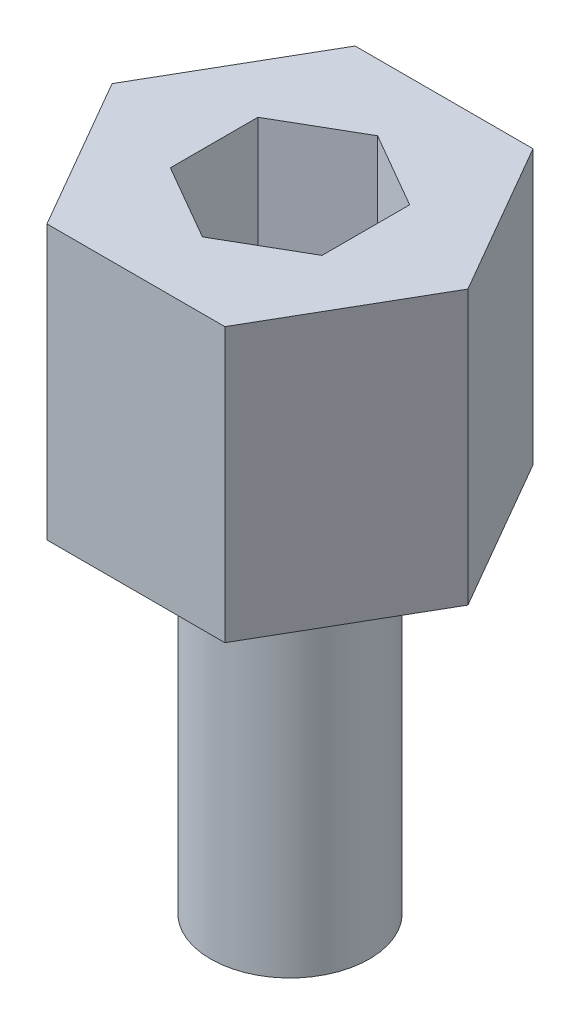
ISO-10303-21;
HEADER;
FILE_DESCRIPTION(('STEP AP214'),'2;1');
FILE_NAME('part.step','',(''),(''),'','','');
FILE_SCHEMA(('AUTOMOTIVE_DESIGN { 1 0 10303 214 1 1 1 1 }'));
ENDSEC;
DATA;
#1=APPLICATION_CONTEXT('core data for automotive mechanical design processes');
#2=APPLICATION_PROTOCOL_DEFINITION('international standard','automotive_design',2000,#1);
#3=PRODUCT_CONTEXT('',#1,'mechanical');
#4=PRODUCT('Part','Part','',(#3));
#5=PRODUCT_RELATED_PRODUCT_CATEGORY('part','',(#4));
#6=PRODUCT_DEFINITION_FORMATION('','',#4);
#7=PRODUCT_DEFINITION_CONTEXT('part definition',#1,'design');
#8=PRODUCT_DEFINITION('design','',#6,#7);
#9=PRODUCT_DEFINITION_SHAPE('','',#8);
#10=(LENGTH_UNIT() NAMED_UNIT(*) SI_UNIT(.MILLI.,.METRE.));
#11=(NAMED_UNIT(*) PLANE_ANGLE_UNIT() SI_UNIT($,.RADIAN.));
#12=(NAMED_UNIT(*) SI_UNIT($,.STERADIAN.) SOLID_ANGLE_UNIT());
#13=UNCERTAINTY_MEASURE_WITH_UNIT(LENGTH_MEASURE(1.E-05),#10,'distance_accuracy_value','');
#14=(GEOMETRIC_REPRESENTATION_CONTEXT(3) GLOBAL_UNCERTAINTY_ASSIGNED_CONTEXT((#13)) GLOBAL_UNIT_ASSIGNED_CONTEXT((#10,
#11,#12)) REPRESENTATION_CONTEXT('',''));
#15=CARTESIAN_POINT('',(0.,0.,0.));
#16=DIRECTION('',(0.,0.,1.));
#17=DIRECTION('',(1.,0.,0.));
#18=AXIS2_PLACEMENT_3D('',#15,#16,#17);
#19=CARTESIAN_POINT('',(0.,25.,0.));
#20=DIRECTION('',(0.,-1.,0.));
#21=DIRECTION('',(0.,0.,-1.));
#22=AXIS2_PLACEMENT_3D('',#19,#20,#21);
#23=CYLINDRICAL_SURFACE('',#22,1.6);
#24=CARTESIAN_POINT('',(0.,0.,0.));
#25=DIRECTION('',(0.,-1.,0.));
#26=DIRECTION('',(0.,0.,-1.));
#27=AXIS2_PLACEMENT_3D('',#24,#25,#26);
#28=CIRCLE('',#27,1.6);
#29=CARTESIAN_POINT('',(0.,0.,-1.6));
#30=VERTEX_POINT('',#29);
#31=EDGE_CURVE('E149',#30,#30,#28,.T.);
#32=CARTESIAN_POINT('',(0.,16.,0.));
#33=DIRECTION('',(0.,1.,0.));
#34=DIRECTION('',(0.,0.,1.));
#35=AXIS2_PLACEMENT_3D('',#32,#33,#34);
#36=CIRCLE('',#35,1.6);
#37=CARTESIAN_POINT('',(0.,16.,-1.6));
#38=VERTEX_POINT('',#37);
#39=EDGE_CURVE('E43',#38,#38,#36,.F.);
#40=CARTESIAN_POINT('',(0.,0.,-1.6));
#41=CARTESIAN_POINT('',(0.,0.166666666666667,-1.6));
#42=CARTESIAN_POINT('',(0.,0.333333333333334,-1.6));
#43=CARTESIAN_POINT('',(0.,0.666666666666667,-1.6));
#44=CARTESIAN_POINT('',(0.,0.833333333333334,-1.6));
#45=CARTESIAN_POINT('',(0.,1.16666666666667,-1.6));
#46=CARTESIAN_POINT('',(0.,1.33333333333333,-1.6));
#47=CARTESIAN_POINT('',(0.,1.66666666666667,-1.6));
#48=CARTESIAN_POINT('',(0.,1.83333333333334,-1.6));
#49=CARTESIAN_POINT('',(0.,2.16666666666667,-1.6));
#50=CARTESIAN_POINT('',(0.,2.33333333333333,-1.6));
#51=CARTESIAN_POINT('',(0.,2.66666666666667,-1.6));
#52=CARTESIAN_POINT('',(0.,2.83333333333333,-1.6));
#53=CARTESIAN_POINT('',(0.,3.16666666666667,-1.6));
#54=CARTESIAN_POINT('',(0.,3.33333333333333,-1.6));
#55=CARTESIAN_POINT('',(0.,3.66666666666667,-1.6));
#56=CARTESIAN_POINT('',(0.,3.83333333333333,-1.6));
#57=CARTESIAN_POINT('',(0.,4.16666666666667,-1.6));
#58=CARTESIAN_POINT('',(0.,4.33333333333333,-1.6));
#59=CARTESIAN_POINT('',(0.,4.66666666666667,-1.6));
#60=CARTESIAN_POINT('',(0.,4.83333333333333,-1.6));
#61=CARTESIAN_POINT('',(0.,5.16666666666667,-1.6));
#62=CARTESIAN_POINT('',(0.,5.33333333333333,-1.6));
#63=CARTESIAN_POINT('',(0.,5.66666666666666,-1.6));
#64=CARTESIAN_POINT('',(0.,5.83333333333333,-1.6));
#65=CARTESIAN_POINT('',(0.,6.16666666666667,-1.6));
#66=CARTESIAN_POINT('',(0.,6.33333333333333,-1.6));
#67=CARTESIAN_POINT('',(0.,6.66666666666667,-1.6));
#68=CARTESIAN_POINT('',(0.,6.83333333333333,-1.6));
#69=CARTESIAN_POINT('',(0.,7.16666666666667,-1.6));
#70=CARTESIAN_POINT('',(0.,7.33333333333333,-1.6));
#71=CARTESIAN_POINT('',(0.,7.66666666666667,-1.6));
#72=CARTESIAN_POINT('',(0.,7.83333333333333,-1.6));
#73=CARTESIAN_POINT('',(0.,8.16666666666667,-1.6));
#74=CARTESIAN_POINT('',(0.,8.33333333333333,-1.6));
#75=CARTESIAN_POINT('',(0.,8.66666666666667,-1.6));
#76=CARTESIAN_POINT('',(0.,8.83333333333333,-1.6));
#77=CARTESIAN_POINT('',(0.,9.16666666666667,-1.6));
#78=CARTESIAN_POINT('',(0.,9.33333333333333,-1.6));
#79=CARTESIAN_POINT('',(0.,9.66666666666667,-1.6));
#80=CARTESIAN_POINT('',(0.,9.83333333333333,-1.6));
#81=CARTESIAN_POINT('',(0.,10.1666666666667,-1.6));
#82=CARTESIAN_POINT('',(0.,10.3333333333333,-1.6));
#83=CARTESIAN_POINT('',(0.,10.6666666666667,-1.6));
#84=CARTESIAN_POINT('',(0.,10.8333333333333,-1.6));
#85=CARTESIAN_POINT('',(0.,11.1666666666667,-1.6));
#86=CARTESIAN_POINT('',(0.,11.3333333333333,-1.6));
#87=CARTESIAN_POINT('',(0.,11.6666666666667,-1.6));
#88=CARTESIAN_POINT('',(0.,11.8333333333333,-1.6));
#89=CARTESIAN_POINT('',(0.,12.1666666666667,-1.6));
#90=CARTESIAN_POINT('',(0.,12.3333333333333,-1.6));
#91=CARTESIAN_POINT('',(0.,12.6666666666667,-1.6));
#92=CARTESIAN_POINT('',(0.,12.8333333333333,-1.6));
#93=CARTESIAN_POINT('',(0.,13.1666666666667,-1.6));
#94=CARTESIAN_POINT('',(0.,13.3333333333333,-1.6));
#95=CARTESIAN_POINT('',(0.,13.6666666666667,-1.6));
#96=CARTESIAN_POINT('',(0.,13.8333333333333,-1.6));
#97=CARTESIAN_POINT('',(0.,14.1666666666667,-1.6));
#98=CARTESIAN_POINT('',(0.,14.3333333333333,-1.6));
#99=CARTESIAN_POINT('',(0.,14.6666666666667,-1.6));
#100=CARTESIAN_POINT('',(0.,14.8333333333333,-1.6));
#101=CARTESIAN_POINT('',(0.,15.1666666666667,-1.6));
#102=CARTESIAN_POINT('',(0.,15.3333333333333,-1.6));
#103=CARTESIAN_POINT('',(0.,15.6666666666667,-1.6));
#104=CARTESIAN_POINT('',(0.,15.8333333333333,-1.6));
#105=CARTESIAN_POINT('',(0.,16.,-1.6));
#106=B_SPLINE_CURVE_WITH_KNOTS('',3,(#40,#41,#42,#43,#44,#45,#46,#47,#48,#49,#50,#51,#52,#53,
#54,#55,#56,#57,#58,#59,#60,#61,#62,#63,#64,#65,#66,#67,#68,#69,#70,#71,#72,#73,#74,#75,#76,#77,
#78,#79,#80,#81,#82,#83,#84,#85,#86,#87,#88,#89,#90,#91,#92,#93,#94,#95,#96,#97,#98,#99,#100,
#101,#102,#103,#104,#105),.UNSPECIFIED.,.F.,.F.,(4,2,2,2,2,2,2,2,2,2,2,2,2,2,2,2,2,2,2,2,2,2,2,
2,2,2,2,2,2,2,2,2,4),(0.,0.5,1.,1.5,2.,2.5,3.,3.5,4.,4.5,5.,5.5,6.,6.5,7.,7.5,8.,8.5,9.,9.5,10.,
10.5,11.,11.5,12.,12.5,13.,13.5,14.,14.5,15.,15.5,16.),.UNSPECIFIED.);
#107=EDGE_CURVE('BSEAM39',#30,#38,#106,.T.);
#108=ORIENTED_EDGE('',*,*,#31,.T.);
#109=ORIENTED_EDGE('',*,*,#39,.F.);
#110=ORIENTED_EDGE('',*,*,#107,.T.);
#111=ORIENTED_EDGE('',*,*,#107,.F.);
#112=EDGE_LOOP('',(#108,#110,#109,#111));
#113=FACE_BOUND('',#112,.T.);
#114=ADVANCED_FACE('F39',(#113),#23,.F.);
#115=CARTESIAN_POINT('',(0.,13.,0.));
#116=DIRECTION('',(0.,-1.,0.));
#117=DIRECTION('',(0.,0.,-1.));
#118=AXIS2_PLACEMENT_3D('',#115,#116,#117);
#119=CYLINDRICAL_SURFACE('',#118,2.9);
#120=CARTESIAN_POINT('',(0.,13.,0.));
#121=DIRECTION('',(0.,1.,0.));
#122=DIRECTION('',(0.,0.,1.));
#123=AXIS2_PLACEMENT_3D('',#120,#121,#122);
#124=CIRCLE('',#123,2.9);
#125=CARTESIAN_POINT('',(0.,13.,2.9));
#126=VERTEX_POINT('',#125);
#127=EDGE_CURVE('E11',#126,#126,#124,.T.);
#128=ORIENTED_EDGE('',*,*,#127,.F.);
#129=EDGE_LOOP('',(#128));
#130=FACE_BOUND('',#129,.T.);
#131=CARTESIAN_POINT('',(0.,0.,0.));
#132=DIRECTION('',(0.,1.,0.));
#133=DIRECTION('',(0.,0.,1.));
#134=AXIS2_PLACEMENT_3D('',#131,#132,#133);
#135=CIRCLE('',#134,2.9);
#136=CARTESIAN_POINT('',(0.,0.,2.9));
#137=VERTEX_POINT('',#136);
#138=EDGE_CURVE('E49',#137,#137,#135,.T.);
#139=ORIENTED_EDGE('',*,*,#138,.T.);
#140=EDGE_LOOP('',(#139));
#141=FACE_BOUND('',#140,.T.);
#142=ADVANCED_FACE('F41',(#130,#141),#119,.T.);
#143=CARTESIAN_POINT('',(0.,0.,0.));
#144=DIRECTION('',(0.,1.,0.));
#145=DIRECTION('',(0.,0.,1.));
#146=AXIS2_PLACEMENT_3D('',#143,#144,#145);
#147=PLANE('',#146);
#148=ORIENTED_EDGE('',*,*,#31,.F.);
#149=EDGE_LOOP('',(#148));
#150=FACE_BOUND('',#149,.T.);
#151=ORIENTED_EDGE('',*,*,#138,.F.);
#152=EDGE_LOOP('',(#151));
#153=FACE_BOUND('',#152,.T.);
#154=ADVANCED_FACE('F180',(#150,#153),#147,.F.);
#155=CARTESIAN_POINT('',(3.25,23.,5.62916512459885));
#156=DIRECTION('',(-0.866025403784439,0.,-0.5));
#157=DIRECTION('',(-0.5,0.,0.866025403784439));
#158=AXIS2_PLACEMENT_3D('',#155,#156,#157);
#159=PLANE('',#158);
#160=DIRECTION('',(0.5,0.,-0.866025403784439));
#161=VECTOR('',#160,1.);
#162=CARTESIAN_POINT('',(3.25,13.,5.62916512459885));
#163=LINE('',#162,#161);
#164=CARTESIAN_POINT('',(3.25,13.,5.62916512459885));
#165=VERTEX_POINT('',#164);
#166=CARTESIAN_POINT('',(6.5,13.,0.));
#167=VERTEX_POINT('',#166);
#168=EDGE_CURVE('E144',#165,#167,#163,.T.);
#169=ORIENTED_EDGE('',*,*,#168,.T.);
#170=DIRECTION('',(0.,-1.,0.));
#171=VECTOR('',#170,1.);
#172=CARTESIAN_POINT('',(6.5,23.,0.));
#173=LINE('',#172,#171);
#174=CARTESIAN_POINT('',(6.5,23.,0.));
#175=VERTEX_POINT('',#174);
#176=EDGE_CURVE('E173',#175,#167,#173,.T.);
#177=ORIENTED_EDGE('',*,*,#176,.F.);
#178=DIRECTION('',(0.5,0.,-0.866025403784439));
#179=VECTOR('',#178,1.);
#180=CARTESIAN_POINT('',(3.25,23.,5.62916512459885));
#181=LINE('',#180,#179);
#182=CARTESIAN_POINT('',(3.25,23.,5.62916512459885));
#183=VERTEX_POINT('',#182);
#184=EDGE_CURVE('E162',#183,#175,#181,.T.);
#185=ORIENTED_EDGE('',*,*,#184,.F.);
#186=DIRECTION('',(0.,-1.,0.));
#187=VECTOR('',#186,1.);
#188=CARTESIAN_POINT('',(3.25,23.,5.62916512459885));
#189=LINE('',#188,#187);
#190=EDGE_CURVE('E140',#183,#165,#189,.T.);
#191=ORIENTED_EDGE('',*,*,#190,.T.);
#192=EDGE_LOOP('',(#169,#177,#185,#191));
#193=FACE_BOUND('',#192,.T.);
#194=ADVANCED_FACE('F182',(#193),#159,.F.);
#195=CARTESIAN_POINT('',(6.5,23.,0.));
#196=DIRECTION('',(-0.866025403784439,0.,0.5));
#197=DIRECTION('',(0.5,0.,0.866025403784439));
#198=AXIS2_PLACEMENT_3D('',#195,#196,#197);
#199=PLANE('',#198);
#200=DIRECTION('',(-0.5,0.,-0.866025403784439));
#201=VECTOR('',#200,1.);
#202=CARTESIAN_POINT('',(6.5,13.,0.));
#203=LINE('',#202,#201);
#204=CARTESIAN_POINT('',(3.25,13.,-5.62916512459886));
#205=VERTEX_POINT('',#204);
#206=EDGE_CURVE('E148',#167,#205,#203,.T.);
#207=ORIENTED_EDGE('',*,*,#206,.T.);
#208=DIRECTION('',(0.,-1.,0.));
#209=VECTOR('',#208,1.);
#210=CARTESIAN_POINT('',(3.25,23.,-5.62916512459886));
#211=LINE('',#210,#209);
#212=CARTESIAN_POINT('',(3.25,23.,-5.62916512459886));
#213=VERTEX_POINT('',#212);
#214=EDGE_CURVE('E169',#213,#205,#211,.T.);
#215=ORIENTED_EDGE('',*,*,#214,.F.);
#216=DIRECTION('',(-0.5,0.,-0.866025403784439));
#217=VECTOR('',#216,1.);
#218=CARTESIAN_POINT('',(6.5,23.,0.));
#219=LINE('',#218,#217);
#220=EDGE_CURVE('E102',#175,#213,#219,.T.);
#221=ORIENTED_EDGE('',*,*,#220,.F.);
#222=ORIENTED_EDGE('',*,*,#176,.T.);
#223=EDGE_LOOP('',(#207,#215,#221,#222));
#224=FACE_BOUND('',#223,.T.);
#225=ADVANCED_FACE('F188',(#224),#199,.F.);
#226=CARTESIAN_POINT('',(3.25,23.,-5.62916512459886));
#227=DIRECTION('',(0.,0.,1.));
#228=DIRECTION('',(1.,0.,0.));
#229=AXIS2_PLACEMENT_3D('',#226,#227,#228);
#230=PLANE('',#229);
#231=DIRECTION('',(-1.,0.,0.));
#232=VECTOR('',#231,1.);
#233=CARTESIAN_POINT('',(3.25,13.,-5.62916512459886));
#234=LINE('',#233,#232);
#235=CARTESIAN_POINT('',(-3.25,13.,-5.62916512459886));
#236=VERTEX_POINT('',#235);
#237=EDGE_CURVE('E152',#205,#236,#234,.T.);
#238=ORIENTED_EDGE('',*,*,#237,.T.);
#239=DIRECTION('',(0.,-1.,0.));
#240=VECTOR('',#239,1.);
#241=CARTESIAN_POINT('',(-3.25,23.,-5.62916512459886));
#242=LINE('',#241,#240);
#243=CARTESIAN_POINT('',(-3.25,23.,-5.62916512459886));
#244=VERTEX_POINT('',#243);
#245=EDGE_CURVE('E133',#244,#236,#242,.T.);
#246=ORIENTED_EDGE('',*,*,#245,.F.);
#247=DIRECTION('',(-1.,0.,0.));
#248=VECTOR('',#247,1.);
#249=CARTESIAN_POINT('',(3.25,23.,-5.62916512459886));
#250=LINE('',#249,#248);
#251=EDGE_CURVE('E119',#213,#244,#250,.T.);
#252=ORIENTED_EDGE('',*,*,#251,.F.);
#253=ORIENTED_EDGE('',*,*,#214,.T.);
#254=EDGE_LOOP('',(#238,#246,#252,#253));
#255=FACE_BOUND('',#254,.T.);
#256=ADVANCED_FACE('F219',(#255),#230,.F.);
#257=CARTESIAN_POINT('',(-3.25,23.,-5.62916512459886));
#258=DIRECTION('',(0.866025403784439,0.,0.5));
#259=DIRECTION('',(0.5,0.,-0.866025403784439));
#260=AXIS2_PLACEMENT_3D('',#257,#258,#259);
#261=PLANE('',#260);
#262=DIRECTION('',(-0.5,0.,0.866025403784439));
#263=VECTOR('',#262,1.);
#264=CARTESIAN_POINT('',(-3.25,13.,-5.62916512459886));
#265=LINE('',#264,#263);
#266=CARTESIAN_POINT('',(-6.5,13.,0.));
#267=VERTEX_POINT('',#266);
#268=EDGE_CURVE('E129',#236,#267,#265,.T.);
#269=ORIENTED_EDGE('',*,*,#268,.T.);
#270=DIRECTION('',(0.,-1.,0.));
#271=VECTOR('',#270,1.);
#272=CARTESIAN_POINT('',(-6.5,23.,0.));
#273=LINE('',#272,#271);
#274=CARTESIAN_POINT('',(-6.5,23.,0.));
#275=VERTEX_POINT('',#274);
#276=EDGE_CURVE('E126',#275,#267,#273,.T.);
#277=ORIENTED_EDGE('',*,*,#276,.F.);
#278=DIRECTION('',(-0.5,0.,0.866025403784439));
#279=VECTOR('',#278,1.);
#280=CARTESIAN_POINT('',(-3.25,23.,-5.62916512459886));
#281=LINE('',#280,#279);
#282=EDGE_CURVE('E112',#244,#275,#281,.T.);
#283=ORIENTED_EDGE('',*,*,#282,.F.);
#284=ORIENTED_EDGE('',*,*,#245,.T.);
#285=EDGE_LOOP('',(#269,#277,#283,#284));
#286=FACE_BOUND('',#285,.T.);
#287=ADVANCED_FACE('F127',(#286),#261,.F.);
#288=CARTESIAN_POINT('',(-6.5,23.,0.));
#289=DIRECTION('',(0.866025403784439,0.,-0.5));
#290=DIRECTION('',(-0.5,0.,-0.866025403784439));
#291=AXIS2_PLACEMENT_3D('',#288,#289,#290);
#292=PLANE('',#291);
#293=DIRECTION('',(0.5,0.,0.866025403784439));
#294=VECTOR('',#293,1.);
#295=CARTESIAN_POINT('',(-6.5,13.,0.));
#296=LINE('',#295,#294);
#297=CARTESIAN_POINT('',(-3.25,13.,5.62916512459885));
#298=VERTEX_POINT('',#297);
#299=EDGE_CURVE('E157',#267,#298,#296,.T.);
#300=ORIENTED_EDGE('',*,*,#299,.T.);
#301=DIRECTION('',(0.,-1.,0.));
#302=VECTOR('',#301,1.);
#303=CARTESIAN_POINT('',(-3.25,23.,5.62916512459885));
#304=LINE('',#303,#302);
#305=CARTESIAN_POINT('',(-3.25,23.,5.62916512459885));
#306=VERTEX_POINT('',#305);
#307=EDGE_CURVE('E134',#306,#298,#304,.T.);
#308=ORIENTED_EDGE('',*,*,#307,.F.);
#309=DIRECTION('',(0.5,0.,0.866025403784439));
#310=VECTOR('',#309,1.);
#311=CARTESIAN_POINT('',(-6.5,23.,0.));
#312=LINE('',#311,#310);
#313=EDGE_CURVE('E116',#275,#306,#312,.T.);
#314=ORIENTED_EDGE('',*,*,#313,.F.);
#315=ORIENTED_EDGE('',*,*,#276,.T.);
#316=EDGE_LOOP('',(#300,#308,#314,#315));
#317=FACE_BOUND('',#316,.T.);
#318=ADVANCED_FACE('F136',(#317),#292,.F.);
#319=CARTESIAN_POINT('',(-3.25,23.,5.62916512459885));
#320=DIRECTION('',(0.,0.,-1.));
#321=DIRECTION('',(-1.,0.,0.));
#322=AXIS2_PLACEMENT_3D('',#319,#320,#321);
#323=PLANE('',#322);
#324=DIRECTION('',(1.,0.,0.));
#325=VECTOR('',#324,1.);
#326=CARTESIAN_POINT('',(-3.25,13.,5.62916512459885));
#327=LINE('',#326,#325);
#328=EDGE_CURVE('E93',#298,#165,#327,.T.);
#329=ORIENTED_EDGE('',*,*,#328,.T.);
#330=ORIENTED_EDGE('',*,*,#190,.F.);
#331=DIRECTION('',(1.,0.,0.));
#332=VECTOR('',#331,1.);
#333=CARTESIAN_POINT('',(-3.25,23.,5.62916512459885));
#334=LINE('',#333,#332);
#335=EDGE_CURVE('E66',#306,#183,#334,.T.);
#336=ORIENTED_EDGE('',*,*,#335,.F.);
#337=ORIENTED_EDGE('',*,*,#307,.T.);
#338=EDGE_LOOP('',(#329,#330,#336,#337));
#339=FACE_BOUND('',#338,.T.);
#340=ADVANCED_FACE('F207',(#339),#323,.F.);
#341=CARTESIAN_POINT('',(0.,23.,0.));
#342=DIRECTION('',(0.,1.,0.));
#343=DIRECTION('',(0.,0.,1.));
#344=AXIS2_PLACEMENT_3D('',#341,#342,#343);
#345=PLANE('',#344);
#346=DIRECTION('',(-0.866025403784438,0.,-0.5));
#347=VECTOR('',#346,1.);
#348=CARTESIAN_POINT('',(2.7712812921102,23.,-1.6));
#349=LINE('',#348,#347);
#350=CARTESIAN_POINT('',(2.7712812921102,23.,-1.6));
#351=VERTEX_POINT('',#350);
#352=CARTESIAN_POINT('',(0.,23.,-3.2));
#353=VERTEX_POINT('',#352);
#354=EDGE_CURVE('E57',#351,#353,#349,.T.);
#355=ORIENTED_EDGE('',*,*,#354,.F.);
#356=DIRECTION('',(0.,0.,-1.));
#357=VECTOR('',#356,1.);
#358=CARTESIAN_POINT('',(2.7712812921102,23.,1.6));
#359=LINE('',#358,#357);
#360=CARTESIAN_POINT('',(2.7712812921102,23.,1.6));
#361=VERTEX_POINT('',#360);
#362=EDGE_CURVE('E262',#361,#351,#359,.T.);
#363=ORIENTED_EDGE('',*,*,#362,.F.);
#364=DIRECTION('',(0.866025403784439,0.,-0.5));
#365=VECTOR('',#364,1.);
#366=CARTESIAN_POINT('',(0.,23.,3.2));
#367=LINE('',#366,#365);
#368=CARTESIAN_POINT('',(0.,23.,3.2));
#369=VERTEX_POINT('',#368);
#370=EDGE_CURVE('E267',#369,#361,#367,.T.);
#371=ORIENTED_EDGE('',*,*,#370,.F.);
#372=DIRECTION('',(0.866025403784438,0.,0.5));
#373=VECTOR('',#372,1.);
#374=CARTESIAN_POINT('',(-2.7712812921102,23.,1.6));
#375=LINE('',#374,#373);
#376=CARTESIAN_POINT('',(-2.7712812921102,23.,1.6));
#377=VERTEX_POINT('',#376);
#378=EDGE_CURVE('E271',#377,#369,#375,.T.);
#379=ORIENTED_EDGE('',*,*,#378,.F.);
#380=DIRECTION('',(0.,0.,1.));
#381=VECTOR('',#380,1.);
#382=CARTESIAN_POINT('',(-2.7712812921102,23.,-1.6));
#383=LINE('',#382,#381);
#384=CARTESIAN_POINT('',(-2.7712812921102,23.,-1.6));
#385=VERTEX_POINT('',#384);
#386=EDGE_CURVE('E275',#385,#377,#383,.T.);
#387=ORIENTED_EDGE('',*,*,#386,.F.);
#388=DIRECTION('',(-0.866025403784439,0.,0.5));
#389=VECTOR('',#388,1.);
#390=CARTESIAN_POINT('',(0.,23.,-3.2));
#391=LINE('',#390,#389);
#392=EDGE_CURVE('E279',#353,#385,#391,.T.);
#393=ORIENTED_EDGE('',*,*,#392,.F.);
#394=EDGE_LOOP('',(#355,#363,#371,#379,#387,#393));
#395=FACE_BOUND('',#394,.T.);
#396=ORIENTED_EDGE('',*,*,#184,.T.);
#397=ORIENTED_EDGE('',*,*,#220,.T.);
#398=ORIENTED_EDGE('',*,*,#251,.T.);
#399=ORIENTED_EDGE('',*,*,#282,.T.);
#400=ORIENTED_EDGE('',*,*,#313,.T.);
#401=ORIENTED_EDGE('',*,*,#335,.T.);
#402=EDGE_LOOP('',(#396,#397,#398,#399,#400,#401));
#403=FACE_BOUND('',#402,.T.);
#404=ADVANCED_FACE('F114',(#395,#403),#345,.T.);
#405=CARTESIAN_POINT('',(0.,13.,0.));
#406=DIRECTION('',(0.,1.,0.));
#407=DIRECTION('',(0.,0.,1.));
#408=AXIS2_PLACEMENT_3D('',#405,#406,#407);
#409=PLANE('',#408);
#410=ORIENTED_EDGE('',*,*,#127,.T.);
#411=EDGE_LOOP('',(#410));
#412=FACE_BOUND('',#411,.T.);
#413=ORIENTED_EDGE('',*,*,#168,.F.);
#414=ORIENTED_EDGE('',*,*,#328,.F.);
#415=ORIENTED_EDGE('',*,*,#299,.F.);
#416=ORIENTED_EDGE('',*,*,#268,.F.);
#417=ORIENTED_EDGE('',*,*,#237,.F.);
#418=ORIENTED_EDGE('',*,*,#206,.F.);
#419=EDGE_LOOP('',(#413,#414,#415,#416,#417,#418));
#420=FACE_BOUND('',#419,.T.);
#421=ADVANCED_FACE('F206',(#412,#420),#409,.F.);
#422=CARTESIAN_POINT('',(0.,16.,0.));
#423=DIRECTION('',(0.,1.,0.));
#424=DIRECTION('',(0.,0.,1.));
#425=AXIS2_PLACEMENT_3D('',#422,#423,#424);
#426=PLANE('',#425);
#427=DIRECTION('',(-0.866025403784438,0.,-0.5));
#428=VECTOR('',#427,1.);
#429=CARTESIAN_POINT('',(2.7712812921102,16.,-1.6));
#430=LINE('',#429,#428);
#431=CARTESIAN_POINT('',(2.7712812921102,16.,-1.6));
#432=VERTEX_POINT('',#431);
#433=CARTESIAN_POINT('',(0.,16.,-3.2));
#434=VERTEX_POINT('',#433);
#435=EDGE_CURVE('E266',#432,#434,#430,.T.);
#436=ORIENTED_EDGE('',*,*,#435,.T.);
#437=DIRECTION('',(-0.866025403784439,0.,0.5));
#438=VECTOR('',#437,1.);
#439=CARTESIAN_POINT('',(0.,16.,-3.2));
#440=LINE('',#439,#438);
#441=CARTESIAN_POINT('',(-2.7712812921102,16.,-1.6));
#442=VERTEX_POINT('',#441);
#443=EDGE_CURVE('E300',#434,#442,#440,.T.);
#444=ORIENTED_EDGE('',*,*,#443,.T.);
#445=DIRECTION('',(0.,0.,1.));
#446=VECTOR('',#445,1.);
#447=CARTESIAN_POINT('',(-2.7712812921102,16.,-1.6));
#448=LINE('',#447,#446);
#449=CARTESIAN_POINT('',(-2.7712812921102,16.,1.6));
#450=VERTEX_POINT('',#449);
#451=EDGE_CURVE('E296',#442,#450,#448,.T.);
#452=ORIENTED_EDGE('',*,*,#451,.T.);
#453=DIRECTION('',(0.866025403784438,0.,0.5));
#454=VECTOR('',#453,1.);
#455=CARTESIAN_POINT('',(-2.7712812921102,16.,1.6));
#456=LINE('',#455,#454);
#457=CARTESIAN_POINT('',(0.,16.,3.2));
#458=VERTEX_POINT('',#457);
#459=EDGE_CURVE('E292',#450,#458,#456,.T.);
#460=ORIENTED_EDGE('',*,*,#459,.T.);
#461=DIRECTION('',(0.866025403784439,0.,-0.5));
#462=VECTOR('',#461,1.);
#463=CARTESIAN_POINT('',(0.,16.,3.2));
#464=LINE('',#463,#462);
#465=CARTESIAN_POINT('',(2.7712812921102,16.,1.6));
#466=VERTEX_POINT('',#465);
#467=EDGE_CURVE('E288',#458,#466,#464,.T.);
#468=ORIENTED_EDGE('',*,*,#467,.T.);
#469=DIRECTION('',(0.,0.,-1.));
#470=VECTOR('',#469,1.);
#471=CARTESIAN_POINT('',(2.7712812921102,16.,1.6));
#472=LINE('',#471,#470);
#473=EDGE_CURVE('E243',#466,#432,#472,.T.);
#474=ORIENTED_EDGE('',*,*,#473,.T.);
#475=EDGE_LOOP('',(#436,#444,#452,#460,#468,#474));
#476=FACE_BOUND('',#475,.T.);
#477=ORIENTED_EDGE('',*,*,#39,.T.);
#478=EDGE_LOOP('',(#477));
#479=FACE_BOUND('',#478,.T.);
#480=ADVANCED_FACE('F211',(#476,#479),#426,.T.);
#481=CARTESIAN_POINT('',(2.7712812921102,16.,-1.6));
#482=DIRECTION('',(0.5,0.,-0.866025403784438));
#483=DIRECTION('',(-0.866025403784439,0.,-0.5));
#484=AXIS2_PLACEMENT_3D('',#481,#482,#483);
#485=PLANE('',#484);
#486=ORIENTED_EDGE('',*,*,#354,.T.);
#487=DIRECTION('',(0.,1.,0.));
#488=VECTOR('',#487,1.);
#489=CARTESIAN_POINT('',(0.,16.,-3.2));
#490=LINE('',#489,#488);
#491=EDGE_CURVE('E239',#434,#353,#490,.T.);
#492=ORIENTED_EDGE('',*,*,#491,.F.);
#493=ORIENTED_EDGE('',*,*,#435,.F.);
#494=DIRECTION('',(0.,1.,0.));
#495=VECTOR('',#494,1.);
#496=CARTESIAN_POINT('',(2.7712812921102,16.,-1.6));
#497=LINE('',#496,#495);
#498=EDGE_CURVE('E259',#432,#351,#497,.T.);
#499=ORIENTED_EDGE('',*,*,#498,.T.);
#500=EDGE_LOOP('',(#486,#492,#493,#499));
#501=FACE_BOUND('',#500,.T.);
#502=ADVANCED_FACE('F202',(#501),#485,.F.);
#503=CARTESIAN_POINT('',(2.7712812921102,16.,1.6));
#504=DIRECTION('',(1.,0.,0.));
#505=DIRECTION('',(0.,0.,-1.));
#506=AXIS2_PLACEMENT_3D('',#503,#504,#505);
#507=PLANE('',#506);
#508=ORIENTED_EDGE('',*,*,#362,.T.);
#509=ORIENTED_EDGE('',*,*,#498,.F.);
#510=ORIENTED_EDGE('',*,*,#473,.F.);
#511=DIRECTION('',(0.,1.,0.));
#512=VECTOR('',#511,1.);
#513=CARTESIAN_POINT('',(2.7712812921102,16.,1.6));
#514=LINE('',#513,#512);
#515=EDGE_CURVE('E255',#466,#361,#514,.T.);
#516=ORIENTED_EDGE('',*,*,#515,.T.);
#517=EDGE_LOOP('',(#508,#509,#510,#516));
#518=FACE_BOUND('',#517,.T.);
#519=ADVANCED_FACE('F329',(#518),#507,.F.);
#520=CARTESIAN_POINT('',(0.,16.,3.2));
#521=DIRECTION('',(0.5,0.,0.866025403784439));
#522=DIRECTION('',(0.866025403784439,0.,-0.5));
#523=AXIS2_PLACEMENT_3D('',#520,#521,#522);
#524=PLANE('',#523);
#525=ORIENTED_EDGE('',*,*,#370,.T.);
#526=ORIENTED_EDGE('',*,*,#515,.F.);
#527=ORIENTED_EDGE('',*,*,#467,.F.);
#528=DIRECTION('',(0.,1.,0.));
#529=VECTOR('',#528,1.);
#530=CARTESIAN_POINT('',(0.,16.,3.2));
#531=LINE('',#530,#529);
#532=EDGE_CURVE('E251',#458,#369,#531,.T.);
#533=ORIENTED_EDGE('',*,*,#532,.T.);
#534=EDGE_LOOP('',(#525,#526,#527,#533));
#535=FACE_BOUND('',#534,.T.);
#536=ADVANCED_FACE('F334',(#535),#524,.F.);
#537=CARTESIAN_POINT('',(-2.7712812921102,16.,1.6));
#538=DIRECTION('',(-0.5,0.,0.866025403784438));
#539=DIRECTION('',(0.866025403784439,0.,0.5));
#540=AXIS2_PLACEMENT_3D('',#537,#538,#539);
#541=PLANE('',#540);
#542=ORIENTED_EDGE('',*,*,#378,.T.);
#543=ORIENTED_EDGE('',*,*,#532,.F.);
#544=ORIENTED_EDGE('',*,*,#459,.F.);
#545=DIRECTION('',(0.,1.,0.));
#546=VECTOR('',#545,1.);
#547=CARTESIAN_POINT('',(-2.7712812921102,16.,1.6));
#548=LINE('',#547,#546);
#549=EDGE_CURVE('E247',#450,#377,#548,.T.);
#550=ORIENTED_EDGE('',*,*,#549,.T.);
#551=EDGE_LOOP('',(#542,#543,#544,#550));
#552=FACE_BOUND('',#551,.T.);
#553=ADVANCED_FACE('F351',(#552),#541,.F.);
#554=CARTESIAN_POINT('',(-2.7712812921102,16.,-1.6));
#555=DIRECTION('',(-1.,0.,0.));
#556=DIRECTION('',(0.,0.,1.));
#557=AXIS2_PLACEMENT_3D('',#554,#555,#556);
#558=PLANE('',#557);
#559=ORIENTED_EDGE('',*,*,#386,.T.);
#560=ORIENTED_EDGE('',*,*,#549,.F.);
#561=ORIENTED_EDGE('',*,*,#451,.F.);
#562=DIRECTION('',(0.,1.,0.));
#563=VECTOR('',#562,1.);
#564=CARTESIAN_POINT('',(-2.7712812921102,16.,-1.6));
#565=LINE('',#564,#563);
#566=EDGE_CURVE('E242',#442,#385,#565,.T.);
#567=ORIENTED_EDGE('',*,*,#566,.T.);
#568=EDGE_LOOP('',(#559,#560,#561,#567));
#569=FACE_BOUND('',#568,.T.);
#570=ADVANCED_FACE('F347',(#569),#558,.F.);
#571=CARTESIAN_POINT('',(0.,16.,-3.2));
#572=DIRECTION('',(-0.5,0.,-0.866025403784439));
#573=DIRECTION('',(-0.866025403784439,0.,0.5));
#574=AXIS2_PLACEMENT_3D('',#571,#572,#573);
#575=PLANE('',#574);
#576=ORIENTED_EDGE('',*,*,#392,.T.);
#577=ORIENTED_EDGE('',*,*,#566,.F.);
#578=ORIENTED_EDGE('',*,*,#443,.F.);
#579=ORIENTED_EDGE('',*,*,#491,.T.);
#580=EDGE_LOOP('',(#576,#577,#578,#579));
#581=FACE_BOUND('',#580,.T.);
#582=ADVANCED_FACE('F341',(#581),#575,.F.);
#583=CLOSED_SHELL('',(#114,#142,#154,#194,#225,#256,#287,#318,#340,#404,#421,#480,#502,#519,
#536,#553,#570,#582));
#584=MANIFOLD_SOLID_BREP('B2',#583);
#585=ADVANCED_BREP_SHAPE_REPRESENTATION('',(#18,#584),#14);
#586=SHAPE_DEFINITION_REPRESENTATION(#9,#585);
ENDSEC;
END-ISO-10303-21;
